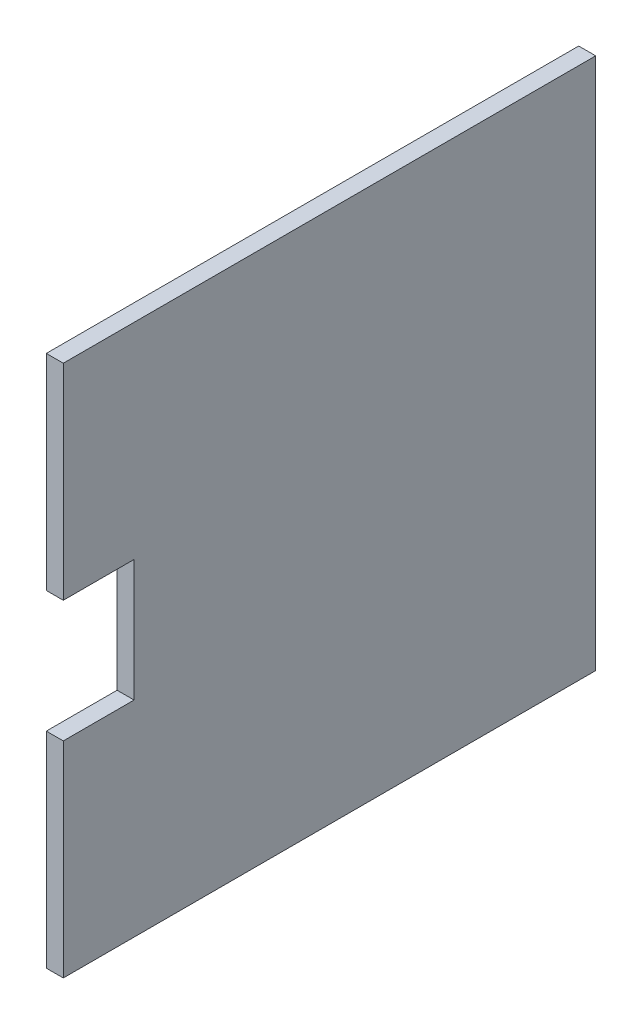
ISO-10303-21;
HEADER;
FILE_DESCRIPTION(('STEP AP214'),'2;1');
FILE_NAME('part.step','',(''),(''),'','','');
FILE_SCHEMA(('AUTOMOTIVE_DESIGN { 1 0 10303 214 1 1 1 1 }'));
ENDSEC;
DATA;
#1=APPLICATION_CONTEXT('core data for automotive mechanical design processes');
#2=APPLICATION_PROTOCOL_DEFINITION('international standard','automotive_design',2000,#1);
#3=PRODUCT_CONTEXT('',#1,'mechanical');
#4=PRODUCT('Part','Part','',(#3));
#5=PRODUCT_RELATED_PRODUCT_CATEGORY('part','',(#4));
#6=PRODUCT_DEFINITION_FORMATION('','',#4);
#7=PRODUCT_DEFINITION_CONTEXT('part definition',#1,'design');
#8=PRODUCT_DEFINITION('design','',#6,#7);
#9=PRODUCT_DEFINITION_SHAPE('','',#8);
#10=(LENGTH_UNIT() NAMED_UNIT(*) SI_UNIT(.MILLI.,.METRE.));
#11=(NAMED_UNIT(*) PLANE_ANGLE_UNIT() SI_UNIT($,.RADIAN.));
#12=(NAMED_UNIT(*) SI_UNIT($,.STERADIAN.) SOLID_ANGLE_UNIT());
#13=UNCERTAINTY_MEASURE_WITH_UNIT(LENGTH_MEASURE(1.E-05),#10,'distance_accuracy_value','');
#14=(GEOMETRIC_REPRESENTATION_CONTEXT(3) GLOBAL_UNCERTAINTY_ASSIGNED_CONTEXT((#13)) GLOBAL_UNIT_ASSIGNED_CONTEXT((#10,
#11,#12)) REPRESENTATION_CONTEXT('',''));
#15=CARTESIAN_POINT('',(0.,0.,0.));
#16=DIRECTION('',(0.,0.,1.));
#17=DIRECTION('',(1.,0.,0.));
#18=AXIS2_PLACEMENT_3D('',#15,#16,#17);
#19=CARTESIAN_POINT('',(6.,77.9093072496867,81.030303030303));
#20=DIRECTION('',(0.,0.,-1.));
#21=DIRECTION('',(-1.,0.,0.));
#22=AXIS2_PLACEMENT_3D('',#19,#20,#21);
#23=PLANE('',#22);
#24=DIRECTION('',(0.,-1.,0.));
#25=VECTOR('',#24,1.);
#26=CARTESIAN_POINT('',(0.,77.9093072496867,81.030303030303));
#27=LINE('',#26,#25);
#28=CARTESIAN_POINT('',(0.,77.9093072496867,81.030303030303));
#29=VERTEX_POINT('',#28);
#30=CARTESIAN_POINT('',(0.,5.40930724968666,81.030303030303));
#31=VERTEX_POINT('',#30);
#32=EDGE_CURVE('E129',#29,#31,#27,.T.);
#33=ORIENTED_EDGE('',*,*,#32,.T.);
#34=DIRECTION('',(-1.,0.,0.));
#35=VECTOR('',#34,1.);
#36=CARTESIAN_POINT('',(6.,5.40930724968666,81.030303030303));
#37=LINE('',#36,#35);
#38=CARTESIAN_POINT('',(6.,5.40930724968666,81.030303030303));
#39=VERTEX_POINT('',#38);
#40=EDGE_CURVE('E11',#39,#31,#37,.T.);
#41=ORIENTED_EDGE('',*,*,#40,.F.);
#42=DIRECTION('',(0.,-1.,0.));
#43=VECTOR('',#42,1.);
#44=CARTESIAN_POINT('',(6.,77.9093072496867,81.030303030303));
#45=LINE('',#44,#43);
#46=CARTESIAN_POINT('',(6.,77.9093072496867,81.030303030303));
#47=VERTEX_POINT('',#46);
#48=EDGE_CURVE('E144',#47,#39,#45,.T.);
#49=ORIENTED_EDGE('',*,*,#48,.F.);
#50=DIRECTION('',(-1.,0.,0.));
#51=VECTOR('',#50,1.);
#52=CARTESIAN_POINT('',(6.,77.9093072496867,81.030303030303));
#53=LINE('',#52,#51);
#54=EDGE_CURVE('E125',#47,#29,#53,.T.);
#55=ORIENTED_EDGE('',*,*,#54,.T.);
#56=EDGE_LOOP('',(#33,#41,#49,#55));
#57=FACE_BOUND('',#56,.T.);
#58=ADVANCED_FACE('F33',(#57),#23,.F.);
#59=CARTESIAN_POINT('',(6.,5.40930724968666,81.030303030303));
#60=DIRECTION('',(0.,1.,0.));
#61=DIRECTION('',(0.,0.,1.));
#62=AXIS2_PLACEMENT_3D('',#59,#60,#61);
#63=PLANE('',#62);
#64=DIRECTION('',(0.,0.,-1.));
#65=VECTOR('',#64,1.);
#66=CARTESIAN_POINT('',(0.,5.40930724968666,81.030303030303));
#67=LINE('',#66,#65);
#68=CARTESIAN_POINT('',(0.,5.40930724968666,56.030303030303));
#69=VERTEX_POINT('',#68);
#70=EDGE_CURVE('E132',#31,#69,#67,.T.);
#71=ORIENTED_EDGE('',*,*,#70,.T.);
#72=DIRECTION('',(-1.,0.,0.));
#73=VECTOR('',#72,1.);
#74=CARTESIAN_POINT('',(6.,5.40930724968666,56.030303030303));
#75=LINE('',#74,#73);
#76=CARTESIAN_POINT('',(6.,5.40930724968666,56.030303030303));
#77=VERTEX_POINT('',#76);
#78=EDGE_CURVE('E41',#77,#69,#75,.T.);
#79=ORIENTED_EDGE('',*,*,#78,.F.);
#80=DIRECTION('',(0.,0.,-1.));
#81=VECTOR('',#80,1.);
#82=CARTESIAN_POINT('',(6.,5.40930724968666,81.030303030303));
#83=LINE('',#82,#81);
#84=EDGE_CURVE('E92',#39,#77,#83,.T.);
#85=ORIENTED_EDGE('',*,*,#84,.F.);
#86=ORIENTED_EDGE('',*,*,#40,.T.);
#87=EDGE_LOOP('',(#71,#79,#85,#86));
#88=FACE_BOUND('',#87,.T.);
#89=ADVANCED_FACE('F159',(#88),#63,.F.);
#90=CARTESIAN_POINT('',(6.,-16.0906927503133,56.030303030303));
#91=DIRECTION('',(0.,0.,-1.));
#92=DIRECTION('',(-1.,0.,0.));
#93=AXIS2_PLACEMENT_3D('',#90,#91,#92);
#94=PLANE('',#93);
#95=DIRECTION('',(0.,-1.,0.));
#96=VECTOR('',#95,1.);
#97=CARTESIAN_POINT('',(0.,-16.0906927503133,56.030303030303));
#98=LINE('',#97,#96);
#99=CARTESIAN_POINT('',(0.,-37.5906927503133,56.030303030303));
#100=VERTEX_POINT('',#99);
#101=EDGE_CURVE('E135',#69,#100,#98,.T.);
#102=ORIENTED_EDGE('',*,*,#101,.T.);
#103=DIRECTION('',(-1.,0.,0.));
#104=VECTOR('',#103,1.);
#105=CARTESIAN_POINT('',(6.,-37.5906927503133,56.030303030303));
#106=LINE('',#105,#104);
#107=CARTESIAN_POINT('',(6.,-37.5906927503133,56.030303030303));
#108=VERTEX_POINT('',#107);
#109=EDGE_CURVE('E151',#108,#100,#106,.T.);
#110=ORIENTED_EDGE('',*,*,#109,.F.);
#111=DIRECTION('',(0.,-1.,0.));
#112=VECTOR('',#111,1.);
#113=CARTESIAN_POINT('',(6.,-16.0906927503133,56.030303030303));
#114=LINE('',#113,#112);
#115=EDGE_CURVE('E158',#77,#108,#114,.T.);
#116=ORIENTED_EDGE('',*,*,#115,.F.);
#117=ORIENTED_EDGE('',*,*,#78,.T.);
#118=EDGE_LOOP('',(#102,#110,#116,#117));
#119=FACE_BOUND('',#118,.T.);
#120=ADVANCED_FACE('F156',(#119),#94,.F.);
#121=CARTESIAN_POINT('',(6.,-37.5906927503133,81.030303030303));
#122=DIRECTION('',(0.,-1.,0.));
#123=DIRECTION('',(0.,0.,-1.));
#124=AXIS2_PLACEMENT_3D('',#121,#122,#123);
#125=PLANE('',#124);
#126=DIRECTION('',(0.,0.,1.));
#127=VECTOR('',#126,1.);
#128=CARTESIAN_POINT('',(0.,-37.5906927503133,81.030303030303));
#129=LINE('',#128,#127);
#130=CARTESIAN_POINT('',(0.,-37.5906927503133,81.030303030303));
#131=VERTEX_POINT('',#130);
#132=EDGE_CURVE('E137',#100,#131,#129,.T.);
#133=ORIENTED_EDGE('',*,*,#132,.T.);
#134=DIRECTION('',(-1.,0.,0.));
#135=VECTOR('',#134,1.);
#136=CARTESIAN_POINT('',(6.,-37.5906927503133,81.030303030303));
#137=LINE('',#136,#135);
#138=CARTESIAN_POINT('',(6.,-37.5906927503133,81.030303030303));
#139=VERTEX_POINT('',#138);
#140=EDGE_CURVE('E148',#139,#131,#137,.T.);
#141=ORIENTED_EDGE('',*,*,#140,.F.);
#142=DIRECTION('',(0.,0.,1.));
#143=VECTOR('',#142,1.);
#144=CARTESIAN_POINT('',(6.,-37.5906927503133,81.030303030303));
#145=LINE('',#144,#143);
#146=EDGE_CURVE('E172',#108,#139,#145,.T.);
#147=ORIENTED_EDGE('',*,*,#146,.F.);
#148=ORIENTED_EDGE('',*,*,#109,.T.);
#149=EDGE_LOOP('',(#133,#141,#147,#148));
#150=FACE_BOUND('',#149,.T.);
#151=ADVANCED_FACE('F168',(#150),#125,.F.);
#152=CARTESIAN_POINT('',(6.,-37.5906927503133,81.030303030303));
#153=DIRECTION('',(0.,0.,-1.));
#154=DIRECTION('',(-1.,0.,0.));
#155=AXIS2_PLACEMENT_3D('',#152,#153,#154);
#156=PLANE('',#155);
#157=DIRECTION('',(0.,-1.,0.));
#158=VECTOR('',#157,1.);
#159=CARTESIAN_POINT('',(0.,-37.5906927503133,81.030303030303));
#160=LINE('',#159,#158);
#161=CARTESIAN_POINT('',(0.,-110.090692750313,81.030303030303));
#162=VERTEX_POINT('',#161);
#163=EDGE_CURVE('E139',#131,#162,#160,.T.);
#164=ORIENTED_EDGE('',*,*,#163,.T.);
#165=DIRECTION('',(-1.,0.,0.));
#166=VECTOR('',#165,1.);
#167=CARTESIAN_POINT('',(6.,-110.090692750313,81.030303030303));
#168=LINE('',#167,#166);
#169=CARTESIAN_POINT('',(6.,-110.090692750313,81.030303030303));
#170=VERTEX_POINT('',#169);
#171=EDGE_CURVE('E120',#170,#162,#168,.T.);
#172=ORIENTED_EDGE('',*,*,#171,.F.);
#173=DIRECTION('',(0.,-1.,0.));
#174=VECTOR('',#173,1.);
#175=CARTESIAN_POINT('',(6.,-37.5906927503133,81.030303030303));
#176=LINE('',#175,#174);
#177=EDGE_CURVE('E111',#139,#170,#176,.T.);
#178=ORIENTED_EDGE('',*,*,#177,.F.);
#179=ORIENTED_EDGE('',*,*,#140,.T.);
#180=EDGE_LOOP('',(#164,#172,#178,#179));
#181=FACE_BOUND('',#180,.T.);
#182=ADVANCED_FACE('F171',(#181),#156,.F.);
#183=CARTESIAN_POINT('',(6.,-110.090692750313,81.030303030303));
#184=DIRECTION('',(0.,1.,0.));
#185=DIRECTION('',(0.,0.,1.));
#186=AXIS2_PLACEMENT_3D('',#183,#184,#185);
#187=PLANE('',#186);
#188=DIRECTION('',(0.,0.,-1.));
#189=VECTOR('',#188,1.);
#190=CARTESIAN_POINT('',(0.,-110.090692750313,81.030303030303));
#191=LINE('',#190,#189);
#192=CARTESIAN_POINT('',(0.,-110.090692750313,-106.969696969697));
#193=VERTEX_POINT('',#192);
#194=EDGE_CURVE('E119',#162,#193,#191,.T.);
#195=ORIENTED_EDGE('',*,*,#194,.T.);
#196=DIRECTION('',(-1.,0.,0.));
#197=VECTOR('',#196,1.);
#198=CARTESIAN_POINT('',(6.,-110.090692750313,-106.969696969697));
#199=LINE('',#198,#197);
#200=CARTESIAN_POINT('',(6.,-110.090692750313,-106.969696969697));
#201=VERTEX_POINT('',#200);
#202=EDGE_CURVE('E116',#201,#193,#199,.T.);
#203=ORIENTED_EDGE('',*,*,#202,.F.);
#204=DIRECTION('',(0.,0.,-1.));
#205=VECTOR('',#204,1.);
#206=CARTESIAN_POINT('',(6.,-110.090692750313,81.030303030303));
#207=LINE('',#206,#205);
#208=EDGE_CURVE('E105',#170,#201,#207,.T.);
#209=ORIENTED_EDGE('',*,*,#208,.F.);
#210=ORIENTED_EDGE('',*,*,#171,.T.);
#211=EDGE_LOOP('',(#195,#203,#209,#210));
#212=FACE_BOUND('',#211,.T.);
#213=ADVANCED_FACE('F117',(#212),#187,.F.);
#214=CARTESIAN_POINT('',(6.,77.9093072496867,-106.969696969697));
#215=DIRECTION('',(0.,0.,1.));
#216=DIRECTION('',(1.,0.,0.));
#217=AXIS2_PLACEMENT_3D('',#214,#215,#216);
#218=PLANE('',#217);
#219=DIRECTION('',(0.,1.,0.));
#220=VECTOR('',#219,1.);
#221=CARTESIAN_POINT('',(0.,77.9093072496867,-106.969696969697));
#222=LINE('',#221,#220);
#223=CARTESIAN_POINT('',(0.,77.9093072496867,-106.969696969697));
#224=VERTEX_POINT('',#223);
#225=EDGE_CURVE('E78',#193,#224,#222,.T.);
#226=ORIENTED_EDGE('',*,*,#225,.T.);
#227=DIRECTION('',(-1.,0.,0.));
#228=VECTOR('',#227,1.);
#229=CARTESIAN_POINT('',(6.,77.9093072496867,-106.969696969697));
#230=LINE('',#229,#228);
#231=CARTESIAN_POINT('',(6.,77.9093072496867,-106.969696969697));
#232=VERTEX_POINT('',#231);
#233=EDGE_CURVE('E121',#232,#224,#230,.T.);
#234=ORIENTED_EDGE('',*,*,#233,.F.);
#235=DIRECTION('',(0.,1.,0.));
#236=VECTOR('',#235,1.);
#237=CARTESIAN_POINT('',(6.,77.9093072496867,-106.969696969697));
#238=LINE('',#237,#236);
#239=EDGE_CURVE('E109',#201,#232,#238,.T.);
#240=ORIENTED_EDGE('',*,*,#239,.F.);
#241=ORIENTED_EDGE('',*,*,#202,.T.);
#242=EDGE_LOOP('',(#226,#234,#240,#241));
#243=FACE_BOUND('',#242,.T.);
#244=ADVANCED_FACE('F123',(#243),#218,.F.);
#245=CARTESIAN_POINT('',(6.,77.9093072496867,81.030303030303));
#246=DIRECTION('',(0.,-1.,0.));
#247=DIRECTION('',(0.,0.,-1.));
#248=AXIS2_PLACEMENT_3D('',#245,#246,#247);
#249=PLANE('',#248);
#250=DIRECTION('',(0.,0.,1.));
#251=VECTOR('',#250,1.);
#252=CARTESIAN_POINT('',(0.,77.9093072496867,81.030303030303));
#253=LINE('',#252,#251);
#254=EDGE_CURVE('E84',#224,#29,#253,.T.);
#255=ORIENTED_EDGE('',*,*,#254,.T.);
#256=ORIENTED_EDGE('',*,*,#54,.F.);
#257=DIRECTION('',(0.,0.,1.));
#258=VECTOR('',#257,1.);
#259=CARTESIAN_POINT('',(6.,77.9093072496867,81.030303030303));
#260=LINE('',#259,#258);
#261=EDGE_CURVE('E49',#232,#47,#260,.T.);
#262=ORIENTED_EDGE('',*,*,#261,.F.);
#263=ORIENTED_EDGE('',*,*,#233,.T.);
#264=EDGE_LOOP('',(#255,#256,#262,#263));
#265=FACE_BOUND('',#264,.T.);
#266=ADVANCED_FACE('F179',(#265),#249,.F.);
#267=CARTESIAN_POINT('',(6.,0.,0.));
#268=DIRECTION('',(1.,0.,0.));
#269=DIRECTION('',(0.,0.,-1.));
#270=AXIS2_PLACEMENT_3D('',#267,#268,#269);
#271=PLANE('',#270);
#272=ORIENTED_EDGE('',*,*,#48,.T.);
#273=ORIENTED_EDGE('',*,*,#84,.T.);
#274=ORIENTED_EDGE('',*,*,#115,.T.);
#275=ORIENTED_EDGE('',*,*,#146,.T.);
#276=ORIENTED_EDGE('',*,*,#177,.T.);
#277=ORIENTED_EDGE('',*,*,#208,.T.);
#278=ORIENTED_EDGE('',*,*,#239,.T.);
#279=ORIENTED_EDGE('',*,*,#261,.T.);
#280=EDGE_LOOP('',(#272,#273,#274,#275,#276,#277,#278,#279));
#281=FACE_BOUND('',#280,.T.);
#282=ADVANCED_FACE('F107',(#281),#271,.T.);
#283=CARTESIAN_POINT('',(0.,0.,0.));
#284=DIRECTION('',(1.,0.,0.));
#285=DIRECTION('',(0.,0.,-1.));
#286=AXIS2_PLACEMENT_3D('',#283,#284,#285);
#287=PLANE('',#286);
#288=ORIENTED_EDGE('',*,*,#32,.F.);
#289=ORIENTED_EDGE('',*,*,#254,.F.);
#290=ORIENTED_EDGE('',*,*,#225,.F.);
#291=ORIENTED_EDGE('',*,*,#194,.F.);
#292=ORIENTED_EDGE('',*,*,#163,.F.);
#293=ORIENTED_EDGE('',*,*,#132,.F.);
#294=ORIENTED_EDGE('',*,*,#101,.F.);
#295=ORIENTED_EDGE('',*,*,#70,.F.);
#296=EDGE_LOOP('',(#288,#289,#290,#291,#292,#293,#294,#295));
#297=FACE_BOUND('',#296,.T.);
#298=ADVANCED_FACE('F163',(#297),#287,.F.);
#299=CLOSED_SHELL('',(#58,#89,#120,#151,#182,#213,#244,#266,#282,#298));
#300=MANIFOLD_SOLID_BREP('B2',#299);
#301=ADVANCED_BREP_SHAPE_REPRESENTATION('',(#18,#300),#14);
#302=SHAPE_DEFINITION_REPRESENTATION(#9,#301);
ENDSEC;
END-ISO-10303-21;
